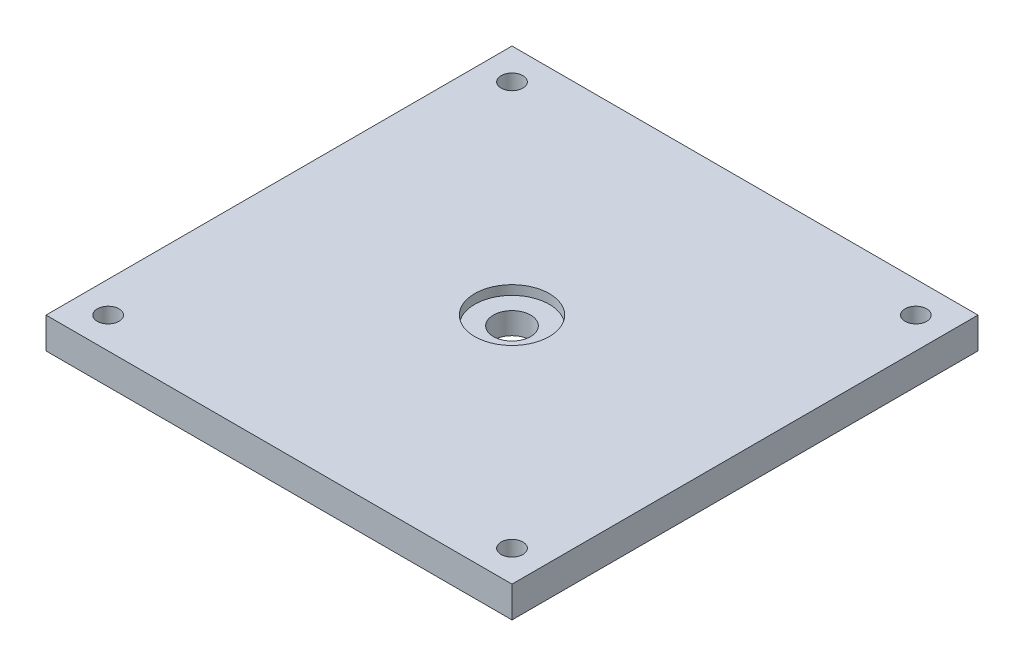
ISO-10303-21;
HEADER;
FILE_DESCRIPTION(('STEP AP214'),'2;1');
FILE_NAME('part.step','',(''),(''),'','','');
FILE_SCHEMA(('AUTOMOTIVE_DESIGN { 1 0 10303 214 1 1 1 1 }'));
ENDSEC;
DATA;
#1=APPLICATION_CONTEXT('core data for automotive mechanical design processes');
#2=APPLICATION_PROTOCOL_DEFINITION('international standard','automotive_design',2000,#1);
#3=PRODUCT_CONTEXT('',#1,'mechanical');
#4=PRODUCT('Part','Part','',(#3));
#5=PRODUCT_RELATED_PRODUCT_CATEGORY('part','',(#4));
#6=PRODUCT_DEFINITION_FORMATION('','',#4);
#7=PRODUCT_DEFINITION_CONTEXT('part definition',#1,'design');
#8=PRODUCT_DEFINITION('design','',#6,#7);
#9=PRODUCT_DEFINITION_SHAPE('','',#8);
#10=(LENGTH_UNIT() NAMED_UNIT(*) SI_UNIT(.MILLI.,.METRE.));
#11=(NAMED_UNIT(*) PLANE_ANGLE_UNIT() SI_UNIT($,.RADIAN.));
#12=(NAMED_UNIT(*) SI_UNIT($,.STERADIAN.) SOLID_ANGLE_UNIT());
#13=UNCERTAINTY_MEASURE_WITH_UNIT(LENGTH_MEASURE(1.E-05),#10,'distance_accuracy_value','');
#14=(GEOMETRIC_REPRESENTATION_CONTEXT(3) GLOBAL_UNCERTAINTY_ASSIGNED_CONTEXT((#13)) GLOBAL_UNIT_ASSIGNED_CONTEXT((#10,
#11,#12)) REPRESENTATION_CONTEXT('',''));
#15=CARTESIAN_POINT('',(0.,0.,0.));
#16=DIRECTION('',(0.,0.,1.));
#17=DIRECTION('',(1.,0.,0.));
#18=AXIS2_PLACEMENT_3D('',#15,#16,#17);
#19=CARTESIAN_POINT('',(75.,10.,-75.));
#20=DIRECTION('',(-1.,0.,0.));
#21=DIRECTION('',(0.,0.,1.));
#22=AXIS2_PLACEMENT_3D('',#19,#20,#21);
#23=PLANE('',#22);
#24=DIRECTION('',(0.,0.,-1.));
#25=VECTOR('',#24,1.);
#26=CARTESIAN_POINT('',(75.,0.,-75.));
#27=LINE('',#26,#25);
#28=CARTESIAN_POINT('',(75.,0.,75.));
#29=VERTEX_POINT('',#28);
#30=CARTESIAN_POINT('',(75.,0.,-75.));
#31=VERTEX_POINT('',#30);
#32=EDGE_CURVE('E145',#29,#31,#27,.T.);
#33=ORIENTED_EDGE('',*,*,#32,.T.);
#34=DIRECTION('',(0.,-1.,0.));
#35=VECTOR('',#34,1.);
#36=CARTESIAN_POINT('',(75.,10.,-75.));
#37=LINE('',#36,#35);
#38=CARTESIAN_POINT('',(75.,10.,-75.));
#39=VERTEX_POINT('',#38);
#40=EDGE_CURVE('E11',#39,#31,#37,.T.);
#41=ORIENTED_EDGE('',*,*,#40,.F.);
#42=DIRECTION('',(0.,0.,-1.));
#43=VECTOR('',#42,1.);
#44=CARTESIAN_POINT('',(75.,10.,-75.));
#45=LINE('',#44,#43);
#46=CARTESIAN_POINT('',(75.,10.,75.));
#47=VERTEX_POINT('',#46);
#48=EDGE_CURVE('E148',#47,#39,#45,.T.);
#49=ORIENTED_EDGE('',*,*,#48,.F.);
#50=DIRECTION('',(0.,-1.,0.));
#51=VECTOR('',#50,1.);
#52=CARTESIAN_POINT('',(75.,10.,75.));
#53=LINE('',#52,#51);
#54=EDGE_CURVE('E154',#47,#29,#53,.T.);
#55=ORIENTED_EDGE('',*,*,#54,.T.);
#56=EDGE_LOOP('',(#33,#41,#49,#55));
#57=FACE_BOUND('',#56,.T.);
#58=ADVANCED_FACE('F36',(#57),#23,.F.);
#59=CARTESIAN_POINT('',(-75.,10.,-75.));
#60=DIRECTION('',(0.,0.,1.));
#61=DIRECTION('',(1.,0.,0.));
#62=AXIS2_PLACEMENT_3D('',#59,#60,#61);
#63=PLANE('',#62);
#64=DIRECTION('',(-1.,0.,0.));
#65=VECTOR('',#64,1.);
#66=CARTESIAN_POINT('',(-75.,0.,-75.));
#67=LINE('',#66,#65);
#68=CARTESIAN_POINT('',(-75.,0.,-75.));
#69=VERTEX_POINT('',#68);
#70=EDGE_CURVE('E157',#31,#69,#67,.T.);
#71=ORIENTED_EDGE('',*,*,#70,.T.);
#72=DIRECTION('',(0.,-1.,0.));
#73=VECTOR('',#72,1.);
#74=CARTESIAN_POINT('',(-75.,10.,-75.));
#75=LINE('',#74,#73);
#76=CARTESIAN_POINT('',(-75.,10.,-75.));
#77=VERTEX_POINT('',#76);
#78=EDGE_CURVE('E44',#77,#69,#75,.T.);
#79=ORIENTED_EDGE('',*,*,#78,.F.);
#80=DIRECTION('',(-1.,0.,0.));
#81=VECTOR('',#80,1.);
#82=CARTESIAN_POINT('',(-75.,10.,-75.));
#83=LINE('',#82,#81);
#84=EDGE_CURVE('E83',#39,#77,#83,.T.);
#85=ORIENTED_EDGE('',*,*,#84,.F.);
#86=ORIENTED_EDGE('',*,*,#40,.T.);
#87=EDGE_LOOP('',(#71,#79,#85,#86));
#88=FACE_BOUND('',#87,.T.);
#89=ADVANCED_FACE('F181',(#88),#63,.F.);
#90=CARTESIAN_POINT('',(-75.,10.,-75.));
#91=DIRECTION('',(1.,0.,0.));
#92=DIRECTION('',(0.,0.,-1.));
#93=AXIS2_PLACEMENT_3D('',#90,#91,#92);
#94=PLANE('',#93);
#95=DIRECTION('',(0.,0.,1.));
#96=VECTOR('',#95,1.);
#97=CARTESIAN_POINT('',(-75.,0.,-75.));
#98=LINE('',#97,#96);
#99=CARTESIAN_POINT('',(-75.,0.,75.));
#100=VERTEX_POINT('',#99);
#101=EDGE_CURVE('E70',#69,#100,#98,.T.);
#102=ORIENTED_EDGE('',*,*,#101,.T.);
#103=DIRECTION('',(0.,-1.,0.));
#104=VECTOR('',#103,1.);
#105=CARTESIAN_POINT('',(-75.,10.,75.));
#106=LINE('',#105,#104);
#107=CARTESIAN_POINT('',(-75.,10.,75.));
#108=VERTEX_POINT('',#107);
#109=EDGE_CURVE('E162',#108,#100,#106,.T.);
#110=ORIENTED_EDGE('',*,*,#109,.F.);
#111=DIRECTION('',(0.,0.,1.));
#112=VECTOR('',#111,1.);
#113=CARTESIAN_POINT('',(-75.,10.,-75.));
#114=LINE('',#113,#112);
#115=EDGE_CURVE('E151',#77,#108,#114,.T.);
#116=ORIENTED_EDGE('',*,*,#115,.F.);
#117=ORIENTED_EDGE('',*,*,#78,.T.);
#118=EDGE_LOOP('',(#102,#110,#116,#117));
#119=FACE_BOUND('',#118,.T.);
#120=ADVANCED_FACE('F164',(#119),#94,.F.);
#121=CARTESIAN_POINT('',(-75.,10.,75.));
#122=DIRECTION('',(0.,0.,-1.));
#123=DIRECTION('',(-1.,0.,0.));
#124=AXIS2_PLACEMENT_3D('',#121,#122,#123);
#125=PLANE('',#124);
#126=DIRECTION('',(1.,0.,0.));
#127=VECTOR('',#126,1.);
#128=CARTESIAN_POINT('',(-75.,0.,75.));
#129=LINE('',#128,#127);
#130=EDGE_CURVE('E76',#100,#29,#129,.T.);
#131=ORIENTED_EDGE('',*,*,#130,.T.);
#132=ORIENTED_EDGE('',*,*,#54,.F.);
#133=DIRECTION('',(1.,0.,0.));
#134=VECTOR('',#133,1.);
#135=CARTESIAN_POINT('',(-75.,10.,75.));
#136=LINE('',#135,#134);
#137=EDGE_CURVE('E52',#108,#47,#136,.T.);
#138=ORIENTED_EDGE('',*,*,#137,.F.);
#139=ORIENTED_EDGE('',*,*,#109,.T.);
#140=EDGE_LOOP('',(#131,#132,#138,#139));
#141=FACE_BOUND('',#140,.T.);
#142=ADVANCED_FACE('F171',(#141),#125,.F.);
#143=CARTESIAN_POINT('',(0.,10.,0.));
#144=DIRECTION('',(0.,1.,0.));
#145=DIRECTION('',(0.,0.,1.));
#146=AXIS2_PLACEMENT_3D('',#143,#144,#145);
#147=PLANE('',#146);
#148=CARTESIAN_POINT('',(65.,10.,65.));
#149=DIRECTION('',(0.,-1.,0.));
#150=DIRECTION('',(0.,0.,-1.));
#151=AXIS2_PLACEMENT_3D('',#148,#149,#150);
#152=CIRCLE('',#151,3.5);
#153=CARTESIAN_POINT('',(65.,10.,61.5));
#154=VERTEX_POINT('',#153);
#155=EDGE_CURVE('E114',#154,#154,#152,.T.);
#156=ORIENTED_EDGE('',*,*,#155,.T.);
#157=EDGE_LOOP('',(#156));
#158=FACE_BOUND('',#157,.T.);
#159=CARTESIAN_POINT('',(65.,10.,-65.));
#160=DIRECTION('',(0.,-1.,0.));
#161=DIRECTION('',(0.,0.,-1.));
#162=AXIS2_PLACEMENT_3D('',#159,#160,#161);
#163=CIRCLE('',#162,3.5);
#164=CARTESIAN_POINT('',(65.,10.,-68.5));
#165=VERTEX_POINT('',#164);
#166=EDGE_CURVE('E120',#165,#165,#163,.T.);
#167=ORIENTED_EDGE('',*,*,#166,.T.);
#168=EDGE_LOOP('',(#167));
#169=FACE_BOUND('',#168,.T.);
#170=CARTESIAN_POINT('',(-65.,10.,-65.));
#171=DIRECTION('',(0.,-1.,0.));
#172=DIRECTION('',(0.,0.,-1.));
#173=AXIS2_PLACEMENT_3D('',#170,#171,#172);
#174=CIRCLE('',#173,3.5);
#175=CARTESIAN_POINT('',(-65.,10.,-68.5));
#176=VERTEX_POINT('',#175);
#177=EDGE_CURVE('E126',#176,#176,#174,.T.);
#178=ORIENTED_EDGE('',*,*,#177,.T.);
#179=EDGE_LOOP('',(#178));
#180=FACE_BOUND('',#179,.T.);
#181=CARTESIAN_POINT('',(-65.,10.,65.));
#182=DIRECTION('',(0.,-1.,0.));
#183=DIRECTION('',(0.,0.,-1.));
#184=AXIS2_PLACEMENT_3D('',#181,#182,#183);
#185=CIRCLE('',#184,3.5);
#186=CARTESIAN_POINT('',(-65.,10.,61.5));
#187=VERTEX_POINT('',#186);
#188=EDGE_CURVE('E132',#187,#187,#185,.T.);
#189=ORIENTED_EDGE('',*,*,#188,.T.);
#190=EDGE_LOOP('',(#189));
#191=FACE_BOUND('',#190,.T.);
#192=CARTESIAN_POINT('',(0.,10.,0.));
#193=DIRECTION('',(0.,1.,0.));
#194=DIRECTION('',(0.,0.,1.));
#195=AXIS2_PLACEMENT_3D('',#192,#193,#194);
#196=CIRCLE('',#195,12.);
#197=CARTESIAN_POINT('',(0.,10.,12.));
#198=VERTEX_POINT('',#197);
#199=EDGE_CURVE('E141',#198,#198,#196,.T.);
#200=ORIENTED_EDGE('',*,*,#199,.F.);
#201=EDGE_LOOP('',(#200));
#202=FACE_BOUND('',#201,.T.);
#203=ORIENTED_EDGE('',*,*,#48,.T.);
#204=ORIENTED_EDGE('',*,*,#84,.T.);
#205=ORIENTED_EDGE('',*,*,#115,.T.);
#206=ORIENTED_EDGE('',*,*,#137,.T.);
#207=EDGE_LOOP('',(#203,#204,#205,#206));
#208=FACE_BOUND('',#207,.T.);
#209=ADVANCED_FACE('F173',(#158,#169,#180,#191,#202,#208),#147,.T.);
#210=CARTESIAN_POINT('',(0.,0.,0.));
#211=DIRECTION('',(0.,1.,0.));
#212=DIRECTION('',(0.,0.,1.));
#213=AXIS2_PLACEMENT_3D('',#210,#211,#212);
#214=PLANE('',#213);
#215=CARTESIAN_POINT('',(-9.525,0.,0.));
#216=DIRECTION('',(0.,-1.,0.));
#217=DIRECTION('',(0.,0.,-1.));
#218=AXIS2_PLACEMENT_3D('',#215,#216,#217);
#219=CIRCLE('',#218,1.025);
#220=CARTESIAN_POINT('',(-9.525,0.,-1.025));
#221=VERTEX_POINT('',#220);
#222=EDGE_CURVE('E101',#221,#221,#219,.T.);
#223=ORIENTED_EDGE('',*,*,#222,.F.);
#224=EDGE_LOOP('',(#223));
#225=FACE_BOUND('',#224,.T.);
#226=CARTESIAN_POINT('',(9.525,0.,0.));
#227=DIRECTION('',(0.,-1.,0.));
#228=DIRECTION('',(0.,0.,-1.));
#229=AXIS2_PLACEMENT_3D('',#226,#227,#228);
#230=CIRCLE('',#229,1.025);
#231=CARTESIAN_POINT('',(9.525,0.,-1.025));
#232=VERTEX_POINT('',#231);
#233=EDGE_CURVE('E100',#232,#232,#230,.T.);
#234=ORIENTED_EDGE('',*,*,#233,.F.);
#235=EDGE_LOOP('',(#234));
#236=FACE_BOUND('',#235,.T.);
#237=CARTESIAN_POINT('',(65.,0.,65.));
#238=DIRECTION('',(0.,-1.,0.));
#239=DIRECTION('',(0.,0.,-1.));
#240=AXIS2_PLACEMENT_3D('',#237,#238,#239);
#241=CIRCLE('',#240,3.5);
#242=CARTESIAN_POINT('',(65.,0.,61.5));
#243=VERTEX_POINT('',#242);
#244=EDGE_CURVE('E111',#243,#243,#241,.T.);
#245=ORIENTED_EDGE('',*,*,#244,.F.);
#246=EDGE_LOOP('',(#245));
#247=FACE_BOUND('',#246,.T.);
#248=CARTESIAN_POINT('',(65.,0.,-65.));
#249=DIRECTION('',(0.,-1.,0.));
#250=DIRECTION('',(0.,0.,-1.));
#251=AXIS2_PLACEMENT_3D('',#248,#249,#250);
#252=CIRCLE('',#251,3.5);
#253=CARTESIAN_POINT('',(65.,0.,-68.5));
#254=VERTEX_POINT('',#253);
#255=EDGE_CURVE('E117',#254,#254,#252,.T.);
#256=ORIENTED_EDGE('',*,*,#255,.F.);
#257=EDGE_LOOP('',(#256));
#258=FACE_BOUND('',#257,.T.);
#259=CARTESIAN_POINT('',(-65.,0.,-65.));
#260=DIRECTION('',(0.,-1.,0.));
#261=DIRECTION('',(0.,0.,-1.));
#262=AXIS2_PLACEMENT_3D('',#259,#260,#261);
#263=CIRCLE('',#262,3.5);
#264=CARTESIAN_POINT('',(-65.,0.,-68.5));
#265=VERTEX_POINT('',#264);
#266=EDGE_CURVE('E123',#265,#265,#263,.T.);
#267=ORIENTED_EDGE('',*,*,#266,.F.);
#268=EDGE_LOOP('',(#267));
#269=FACE_BOUND('',#268,.T.);
#270=CARTESIAN_POINT('',(-65.,0.,65.));
#271=DIRECTION('',(0.,-1.,0.));
#272=DIRECTION('',(0.,0.,-1.));
#273=AXIS2_PLACEMENT_3D('',#270,#271,#272);
#274=CIRCLE('',#273,3.5);
#275=CARTESIAN_POINT('',(-65.,0.,61.5));
#276=VERTEX_POINT('',#275);
#277=EDGE_CURVE('E129',#276,#276,#274,.T.);
#278=ORIENTED_EDGE('',*,*,#277,.F.);
#279=EDGE_LOOP('',(#278));
#280=FACE_BOUND('',#279,.T.);
#281=CARTESIAN_POINT('',(0.,0.,0.));
#282=DIRECTION('',(0.,1.,0.));
#283=DIRECTION('',(0.,0.,1.));
#284=AXIS2_PLACEMENT_3D('',#281,#282,#283);
#285=CIRCLE('',#284,6.);
#286=CARTESIAN_POINT('',(0.,0.,6.));
#287=VERTEX_POINT('',#286);
#288=EDGE_CURVE('E138',#287,#287,#285,.F.);
#289=ORIENTED_EDGE('',*,*,#288,.F.);
#290=EDGE_LOOP('',(#289));
#291=FACE_BOUND('',#290,.T.);
#292=ORIENTED_EDGE('',*,*,#32,.F.);
#293=ORIENTED_EDGE('',*,*,#130,.F.);
#294=ORIENTED_EDGE('',*,*,#101,.F.);
#295=ORIENTED_EDGE('',*,*,#70,.F.);
#296=EDGE_LOOP('',(#292,#293,#294,#295));
#297=FACE_BOUND('',#296,.T.);
#298=ADVANCED_FACE('F167',(#225,#236,#247,#258,#269,#280,#291,#297),#214,.F.);
#299=CARTESIAN_POINT('',(0.,7.,0.));
#300=DIRECTION('',(0.,1.,0.));
#301=DIRECTION('',(0.,0.,1.));
#302=AXIS2_PLACEMENT_3D('',#299,#300,#301);
#303=CYLINDRICAL_SURFACE('',#302,12.);
#304=CARTESIAN_POINT('',(0.,7.,0.));
#305=DIRECTION('',(0.,1.,0.));
#306=DIRECTION('',(0.,0.,1.));
#307=AXIS2_PLACEMENT_3D('',#304,#305,#306);
#308=CIRCLE('',#307,12.);
#309=CARTESIAN_POINT('',(0.,7.,12.));
#310=VERTEX_POINT('',#309);
#311=EDGE_CURVE('E142',#310,#310,#308,.T.);
#312=ORIENTED_EDGE('',*,*,#311,.F.);
#313=EDGE_LOOP('',(#312));
#314=FACE_BOUND('',#313,.T.);
#315=ORIENTED_EDGE('',*,*,#199,.T.);
#316=EDGE_LOOP('',(#315));
#317=FACE_BOUND('',#316,.T.);
#318=ADVANCED_FACE('F204',(#314,#317),#303,.F.);
#319=CARTESIAN_POINT('',(0.,7.,0.));
#320=DIRECTION('',(0.,1.,0.));
#321=DIRECTION('',(0.,0.,1.));
#322=AXIS2_PLACEMENT_3D('',#319,#320,#321);
#323=PLANE('',#322);
#324=CARTESIAN_POINT('',(0.,7.,0.));
#325=DIRECTION('',(0.,1.,0.));
#326=DIRECTION('',(0.,0.,1.));
#327=AXIS2_PLACEMENT_3D('',#324,#325,#326);
#328=CIRCLE('',#327,6.);
#329=CARTESIAN_POINT('',(0.,7.,6.));
#330=VERTEX_POINT('',#329);
#331=EDGE_CURVE('E135',#330,#330,#328,.T.);
#332=ORIENTED_EDGE('',*,*,#331,.F.);
#333=EDGE_LOOP('',(#332));
#334=FACE_BOUND('',#333,.T.);
#335=ORIENTED_EDGE('',*,*,#311,.T.);
#336=EDGE_LOOP('',(#335));
#337=FACE_BOUND('',#336,.T.);
#338=ADVANCED_FACE('F209',(#334,#337),#323,.T.);
#339=CARTESIAN_POINT('',(0.,-16.9705627484771,0.));
#340=DIRECTION('',(0.,1.,0.));
#341=DIRECTION('',(0.,0.,1.));
#342=AXIS2_PLACEMENT_3D('',#339,#340,#341);
#343=CYLINDRICAL_SURFACE('',#342,6.);
#344=ORIENTED_EDGE('',*,*,#288,.T.);
#345=EDGE_LOOP('',(#344));
#346=FACE_BOUND('',#345,.T.);
#347=ORIENTED_EDGE('',*,*,#331,.T.);
#348=EDGE_LOOP('',(#347));
#349=FACE_BOUND('',#348,.T.);
#350=ADVANCED_FACE('F221',(#346,#349),#343,.F.);
#351=CARTESIAN_POINT('',(-65.,0.,65.));
#352=DIRECTION('',(0.,-1.,0.));
#353=DIRECTION('',(0.,0.,-1.));
#354=AXIS2_PLACEMENT_3D('',#351,#352,#353);
#355=CYLINDRICAL_SURFACE('',#354,3.5);
#356=ORIENTED_EDGE('',*,*,#188,.F.);
#357=EDGE_LOOP('',(#356));
#358=FACE_BOUND('',#357,.T.);
#359=ORIENTED_EDGE('',*,*,#277,.T.);
#360=EDGE_LOOP('',(#359));
#361=FACE_BOUND('',#360,.T.);
#362=ADVANCED_FACE('F231',(#358,#361),#355,.F.);
#363=CARTESIAN_POINT('',(-65.,0.,-65.));
#364=DIRECTION('',(0.,-1.,0.));
#365=DIRECTION('',(0.,0.,-1.));
#366=AXIS2_PLACEMENT_3D('',#363,#364,#365);
#367=CYLINDRICAL_SURFACE('',#366,3.5);
#368=ORIENTED_EDGE('',*,*,#177,.F.);
#369=EDGE_LOOP('',(#368));
#370=FACE_BOUND('',#369,.T.);
#371=ORIENTED_EDGE('',*,*,#266,.T.);
#372=EDGE_LOOP('',(#371));
#373=FACE_BOUND('',#372,.T.);
#374=ADVANCED_FACE('F247',(#370,#373),#367,.F.);
#375=CARTESIAN_POINT('',(65.,0.,-65.));
#376=DIRECTION('',(0.,-1.,0.));
#377=DIRECTION('',(0.,0.,-1.));
#378=AXIS2_PLACEMENT_3D('',#375,#376,#377);
#379=CYLINDRICAL_SURFACE('',#378,3.5);
#380=ORIENTED_EDGE('',*,*,#166,.F.);
#381=EDGE_LOOP('',(#380));
#382=FACE_BOUND('',#381,.T.);
#383=ORIENTED_EDGE('',*,*,#255,.T.);
#384=EDGE_LOOP('',(#383));
#385=FACE_BOUND('',#384,.T.);
#386=ADVANCED_FACE('F259',(#382,#385),#379,.F.);
#387=CARTESIAN_POINT('',(65.,0.,65.));
#388=DIRECTION('',(0.,-1.,0.));
#389=DIRECTION('',(0.,0.,-1.));
#390=AXIS2_PLACEMENT_3D('',#387,#388,#389);
#391=CYLINDRICAL_SURFACE('',#390,3.5);
#392=ORIENTED_EDGE('',*,*,#155,.F.);
#393=EDGE_LOOP('',(#392));
#394=FACE_BOUND('',#393,.T.);
#395=ORIENTED_EDGE('',*,*,#244,.T.);
#396=EDGE_LOOP('',(#395));
#397=FACE_BOUND('',#396,.T.);
#398=ADVANCED_FACE('F270',(#394,#397),#391,.F.);
#399=CARTESIAN_POINT('',(9.525,5.35,0.));
#400=DIRECTION('',(0.,-1.,0.));
#401=DIRECTION('',(0.,0.,-1.));
#402=AXIS2_PLACEMENT_3D('',#399,#400,#401);
#403=CONICAL_SURFACE('',#402,1.025,1.02974425867665);
#404=CARTESIAN_POINT('',(9.525,5.96588213450325,0.));
#405=VERTEX_POINT('',#404);
#406=VERTEX_LOOP('',#405);
#407=FACE_BOUND('',#406,.T.);
#408=CARTESIAN_POINT('',(9.525,5.35,0.));
#409=DIRECTION('',(0.,-1.,0.));
#410=DIRECTION('',(0.,0.,-1.));
#411=AXIS2_PLACEMENT_3D('',#408,#409,#410);
#412=CIRCLE('',#411,1.025);
#413=CARTESIAN_POINT('',(9.525,5.35,-1.025));
#414=VERTEX_POINT('',#413);
#415=EDGE_CURVE('E104',#414,#414,#412,.T.);
#416=ORIENTED_EDGE('',*,*,#415,.T.);
#417=EDGE_LOOP('',(#416));
#418=FACE_BOUND('',#417,.T.);
#419=ADVANCED_FACE('F281',(#407,#418),#403,.F.);
#420=CARTESIAN_POINT('',(9.525,0.,0.));
#421=DIRECTION('',(0.,-1.,0.));
#422=DIRECTION('',(0.,0.,-1.));
#423=AXIS2_PLACEMENT_3D('',#420,#421,#422);
#424=CYLINDRICAL_SURFACE('',#423,1.025);
#425=ORIENTED_EDGE('',*,*,#415,.F.);
#426=EDGE_LOOP('',(#425));
#427=FACE_BOUND('',#426,.T.);
#428=ORIENTED_EDGE('',*,*,#233,.T.);
#429=EDGE_LOOP('',(#428));
#430=FACE_BOUND('',#429,.T.);
#431=ADVANCED_FACE('F94',(#427,#430),#424,.F.);
#432=CARTESIAN_POINT('',(-9.525,5.35,0.));
#433=DIRECTION('',(0.,-1.,0.));
#434=DIRECTION('',(0.,0.,-1.));
#435=AXIS2_PLACEMENT_3D('',#432,#433,#434);
#436=CONICAL_SURFACE('',#435,1.025,1.02974425867665);
#437=CARTESIAN_POINT('',(-9.525,5.96588213450325,0.));
#438=VERTEX_POINT('',#437);
#439=VERTEX_LOOP('',#438);
#440=FACE_BOUND('',#439,.T.);
#441=CARTESIAN_POINT('',(-9.525,5.35,0.));
#442=DIRECTION('',(0.,-1.,0.));
#443=DIRECTION('',(0.,0.,-1.));
#444=AXIS2_PLACEMENT_3D('',#441,#442,#443);
#445=CIRCLE('',#444,1.025);
#446=CARTESIAN_POINT('',(-9.525,5.35,-1.025));
#447=VERTEX_POINT('',#446);
#448=EDGE_CURVE('E98',#447,#447,#445,.T.);
#449=ORIENTED_EDGE('',*,*,#448,.T.);
#450=EDGE_LOOP('',(#449));
#451=FACE_BOUND('',#450,.T.);
#452=ADVANCED_FACE('F90',(#440,#451),#436,.F.);
#453=CARTESIAN_POINT('',(-9.525,0.,0.));
#454=DIRECTION('',(0.,-1.,0.));
#455=DIRECTION('',(0.,0.,-1.));
#456=AXIS2_PLACEMENT_3D('',#453,#454,#455);
#457=CYLINDRICAL_SURFACE('',#456,1.025);
#458=ORIENTED_EDGE('',*,*,#448,.F.);
#459=EDGE_LOOP('',(#458));
#460=FACE_BOUND('',#459,.T.);
#461=ORIENTED_EDGE('',*,*,#222,.T.);
#462=EDGE_LOOP('',(#461));
#463=FACE_BOUND('',#462,.T.);
#464=ADVANCED_FACE('F93',(#460,#463),#457,.F.);
#465=CLOSED_SHELL('',(#58,#89,#120,#142,#209,#298,#318,#338,#350,#362,#374,#386,#398,#419,#431,
#452,#464));
#466=MANIFOLD_SOLID_BREP('B2',#465);
#467=ADVANCED_BREP_SHAPE_REPRESENTATION('',(#18,#466),#14);
#468=SHAPE_DEFINITION_REPRESENTATION(#9,#467);
ENDSEC;
END-ISO-10303-21;
